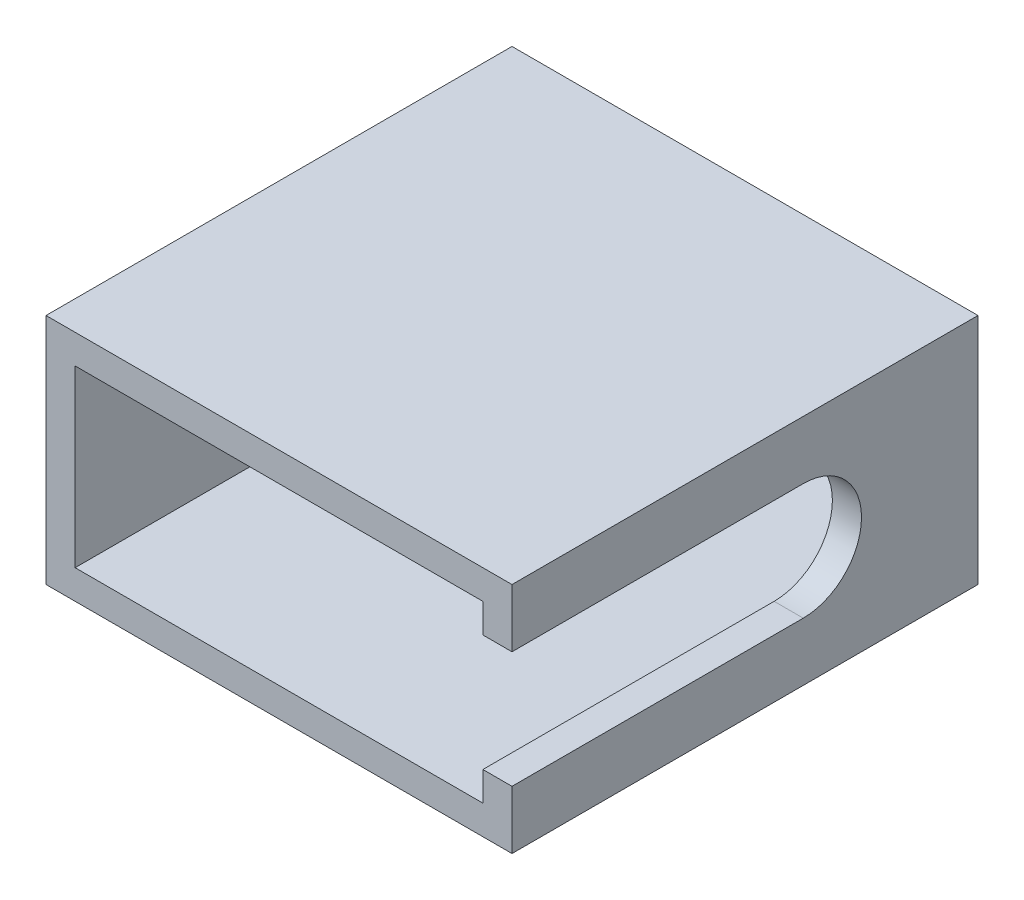
ISO-10303-21;
HEADER;
FILE_DESCRIPTION(('STEP AP214'),'2;1');
FILE_NAME('part.step','',(''),(''),'','','');
FILE_SCHEMA(('AUTOMOTIVE_DESIGN { 1 0 10303 214 1 1 1 1 }'));
ENDSEC;
DATA;
#1=APPLICATION_CONTEXT('core data for automotive mechanical design processes');
#2=APPLICATION_PROTOCOL_DEFINITION('international standard','automotive_design',2000,#1);
#3=PRODUCT_CONTEXT('',#1,'mechanical');
#4=PRODUCT('Part','Part','',(#3));
#5=PRODUCT_RELATED_PRODUCT_CATEGORY('part','',(#4));
#6=PRODUCT_DEFINITION_FORMATION('','',#4);
#7=PRODUCT_DEFINITION_CONTEXT('part definition',#1,'design');
#8=PRODUCT_DEFINITION('design','',#6,#7);
#9=PRODUCT_DEFINITION_SHAPE('','',#8);
#10=(LENGTH_UNIT() NAMED_UNIT(*) SI_UNIT(.MILLI.,.METRE.));
#11=(NAMED_UNIT(*) PLANE_ANGLE_UNIT() SI_UNIT($,.RADIAN.));
#12=(NAMED_UNIT(*) SI_UNIT($,.STERADIAN.) SOLID_ANGLE_UNIT());
#13=UNCERTAINTY_MEASURE_WITH_UNIT(LENGTH_MEASURE(1.E-05),#10,'distance_accuracy_value','');
#14=(GEOMETRIC_REPRESENTATION_CONTEXT(3) GLOBAL_UNCERTAINTY_ASSIGNED_CONTEXT((#13)) GLOBAL_UNIT_ASSIGNED_CONTEXT((#10,
#11,#12)) REPRESENTATION_CONTEXT('',''));
#15=CARTESIAN_POINT('',(0.,0.,0.));
#16=DIRECTION('',(0.,0.,1.));
#17=DIRECTION('',(1.,0.,0.));
#18=AXIS2_PLACEMENT_3D('',#15,#16,#17);
#19=CARTESIAN_POINT('',(25.4,12.7,50.8));
#20=DIRECTION('',(-1.,0.,0.));
#21=DIRECTION('',(0.,-1.,0.));
#22=AXIS2_PLACEMENT_3D('',#19,#20,#21);
#23=PLANE('',#22);
#24=DIRECTION('',(0.,1.,0.));
#25=VECTOR('',#24,1.);
#26=CARTESIAN_POINT('',(25.4,12.7,50.8));
#27=LINE('',#26,#25);
#28=CARTESIAN_POINT('',(25.4,6.35000000000001,50.8));
#29=VERTEX_POINT('',#28);
#30=CARTESIAN_POINT('',(25.4,12.7,50.8));
#31=VERTEX_POINT('',#30);
#32=EDGE_CURVE('E137',#29,#31,#27,.T.);
#33=ORIENTED_EDGE('',*,*,#32,.F.);
#34=DIRECTION('',(0.,0.,1.));
#35=VECTOR('',#34,1.);
#36=CARTESIAN_POINT('',(25.4,6.35000000000001,50.8));
#37=LINE('',#36,#35);
#38=CARTESIAN_POINT('',(25.4,6.35000000000001,19.05));
#39=VERTEX_POINT('',#38);
#40=EDGE_CURVE('E120',#39,#29,#37,.T.);
#41=ORIENTED_EDGE('',*,*,#40,.F.);
#42=CARTESIAN_POINT('',(25.4,0.,19.05));
#43=DIRECTION('',(1.,0.,0.));
#44=DIRECTION('',(0.,1.,0.));
#45=AXIS2_PLACEMENT_3D('',#42,#43,#44);
#46=CIRCLE('',#45,6.35);
#47=CARTESIAN_POINT('',(25.4,-6.34999999999999,19.05));
#48=VERTEX_POINT('',#47);
#49=EDGE_CURVE('E132',#48,#39,#46,.T.);
#50=ORIENTED_EDGE('',*,*,#49,.F.);
#51=DIRECTION('',(0.,0.,-1.));
#52=VECTOR('',#51,1.);
#53=CARTESIAN_POINT('',(25.4,-6.34999999999999,50.8));
#54=LINE('',#53,#52);
#55=CARTESIAN_POINT('',(25.4,-6.34999999999999,50.8));
#56=VERTEX_POINT('',#55);
#57=EDGE_CURVE('E191',#56,#48,#54,.T.);
#58=ORIENTED_EDGE('',*,*,#57,.F.);
#59=CARTESIAN_POINT('',(25.4,-12.7,50.8));
#60=VERTEX_POINT('',#59);
#61=EDGE_CURVE('E146',#60,#56,#27,.T.);
#62=ORIENTED_EDGE('',*,*,#61,.F.);
#63=DIRECTION('',(0.,0.,-1.));
#64=VECTOR('',#63,1.);
#65=CARTESIAN_POINT('',(25.4,-12.7,50.8));
#66=LINE('',#65,#64);
#67=CARTESIAN_POINT('',(25.4,-12.7,0.));
#68=VERTEX_POINT('',#67);
#69=EDGE_CURVE('E162',#60,#68,#66,.T.);
#70=ORIENTED_EDGE('',*,*,#69,.T.);
#71=DIRECTION('',(0.,1.,0.));
#72=VECTOR('',#71,1.);
#73=CARTESIAN_POINT('',(25.4,12.7,0.));
#74=LINE('',#73,#72);
#75=CARTESIAN_POINT('',(25.4,12.7,0.));
#76=VERTEX_POINT('',#75);
#77=EDGE_CURVE('E163',#68,#76,#74,.T.);
#78=ORIENTED_EDGE('',*,*,#77,.T.);
#79=DIRECTION('',(0.,0.,-1.));
#80=VECTOR('',#79,1.);
#81=CARTESIAN_POINT('',(25.4,12.7,50.8));
#82=LINE('',#81,#80);
#83=EDGE_CURVE('E11',#31,#76,#82,.T.);
#84=ORIENTED_EDGE('',*,*,#83,.F.);
#85=EDGE_LOOP('',(#33,#41,#50,#58,#62,#70,#78,#84));
#86=FACE_BOUND('',#85,.T.);
#87=ADVANCED_FACE('F33',(#86),#23,.F.);
#88=CARTESIAN_POINT('',(-25.4,12.7,50.8));
#89=DIRECTION('',(0.,-1.,0.));
#90=DIRECTION('',(0.,0.,-1.));
#91=AXIS2_PLACEMENT_3D('',#88,#89,#90);
#92=PLANE('',#91);
#93=DIRECTION('',(-1.,0.,0.));
#94=VECTOR('',#93,1.);
#95=CARTESIAN_POINT('',(-25.4,12.7,0.));
#96=LINE('',#95,#94);
#97=CARTESIAN_POINT('',(-25.4,12.7,0.));
#98=VERTEX_POINT('',#97);
#99=EDGE_CURVE('E165',#76,#98,#96,.T.);
#100=ORIENTED_EDGE('',*,*,#99,.T.);
#101=DIRECTION('',(0.,0.,-1.));
#102=VECTOR('',#101,1.);
#103=CARTESIAN_POINT('',(-25.4,12.7,50.8));
#104=LINE('',#103,#102);
#105=CARTESIAN_POINT('',(-25.4,12.7,50.8));
#106=VERTEX_POINT('',#105);
#107=EDGE_CURVE('E40',#106,#98,#104,.T.);
#108=ORIENTED_EDGE('',*,*,#107,.F.);
#109=DIRECTION('',(-1.,0.,0.));
#110=VECTOR('',#109,1.);
#111=CARTESIAN_POINT('',(-25.4,12.7,50.8));
#112=LINE('',#111,#110);
#113=EDGE_CURVE('E150',#31,#106,#112,.T.);
#114=ORIENTED_EDGE('',*,*,#113,.F.);
#115=ORIENTED_EDGE('',*,*,#83,.T.);
#116=EDGE_LOOP('',(#100,#108,#114,#115));
#117=FACE_BOUND('',#116,.T.);
#118=ADVANCED_FACE('F196',(#117),#92,.F.);
#119=CARTESIAN_POINT('',(-25.4,12.7,50.8));
#120=DIRECTION('',(1.,0.,0.));
#121=DIRECTION('',(0.,1.,0.));
#122=AXIS2_PLACEMENT_3D('',#119,#120,#121);
#123=PLANE('',#122);
#124=DIRECTION('',(0.,-1.,0.));
#125=VECTOR('',#124,1.);
#126=CARTESIAN_POINT('',(-25.4,12.7,0.));
#127=LINE('',#126,#125);
#128=CARTESIAN_POINT('',(-25.4,-12.7,0.));
#129=VERTEX_POINT('',#128);
#130=EDGE_CURVE('E151',#98,#129,#127,.T.);
#131=ORIENTED_EDGE('',*,*,#130,.T.);
#132=DIRECTION('',(0.,0.,-1.));
#133=VECTOR('',#132,1.);
#134=CARTESIAN_POINT('',(-25.4,-12.7,50.8));
#135=LINE('',#134,#133);
#136=CARTESIAN_POINT('',(-25.4,-12.7,50.8));
#137=VERTEX_POINT('',#136);
#138=EDGE_CURVE('E171',#137,#129,#135,.T.);
#139=ORIENTED_EDGE('',*,*,#138,.F.);
#140=DIRECTION('',(0.,-1.,0.));
#141=VECTOR('',#140,1.);
#142=CARTESIAN_POINT('',(-25.4,12.7,50.8));
#143=LINE('',#142,#141);
#144=EDGE_CURVE('E158',#106,#137,#143,.T.);
#145=ORIENTED_EDGE('',*,*,#144,.F.);
#146=ORIENTED_EDGE('',*,*,#107,.T.);
#147=EDGE_LOOP('',(#131,#139,#145,#146));
#148=FACE_BOUND('',#147,.T.);
#149=ADVANCED_FACE('F178',(#148),#123,.F.);
#150=CARTESIAN_POINT('',(-25.4,-12.7,50.8));
#151=DIRECTION('',(0.,1.,0.));
#152=DIRECTION('',(0.,0.,1.));
#153=AXIS2_PLACEMENT_3D('',#150,#151,#152);
#154=PLANE('',#153);
#155=DIRECTION('',(1.,0.,0.));
#156=VECTOR('',#155,1.);
#157=CARTESIAN_POINT('',(-25.4,-12.7,0.));
#158=LINE('',#157,#156);
#159=EDGE_CURVE('E147',#129,#68,#158,.T.);
#160=ORIENTED_EDGE('',*,*,#159,.T.);
#161=ORIENTED_EDGE('',*,*,#69,.F.);
#162=DIRECTION('',(1.,0.,0.));
#163=VECTOR('',#162,1.);
#164=CARTESIAN_POINT('',(-25.4,-12.7,50.8));
#165=LINE('',#164,#163);
#166=EDGE_CURVE('E160',#137,#60,#165,.T.);
#167=ORIENTED_EDGE('',*,*,#166,.F.);
#168=ORIENTED_EDGE('',*,*,#138,.T.);
#169=EDGE_LOOP('',(#160,#161,#167,#168));
#170=FACE_BOUND('',#169,.T.);
#171=ADVANCED_FACE('F187',(#170),#154,.F.);
#172=CARTESIAN_POINT('',(25.4,-12.7,50.8));
#173=DIRECTION('',(0.,0.,1.));
#174=DIRECTION('',(1.,0.,0.));
#175=AXIS2_PLACEMENT_3D('',#172,#173,#174);
#176=PLANE('',#175);
#177=DIRECTION('',(1.,0.,0.));
#178=VECTOR('',#177,1.);
#179=CARTESIAN_POINT('',(-25.401,6.35,50.8));
#180=LINE('',#179,#178);
#181=CARTESIAN_POINT('',(22.225,6.35000000000001,50.8));
#182=VERTEX_POINT('',#181);
#183=EDGE_CURVE('E123',#182,#29,#180,.T.);
#184=ORIENTED_EDGE('',*,*,#183,.T.);
#185=ORIENTED_EDGE('',*,*,#32,.T.);
#186=ORIENTED_EDGE('',*,*,#113,.T.);
#187=ORIENTED_EDGE('',*,*,#144,.T.);
#188=ORIENTED_EDGE('',*,*,#166,.T.);
#189=ORIENTED_EDGE('',*,*,#61,.T.);
#190=DIRECTION('',(1.,0.,0.));
#191=VECTOR('',#190,1.);
#192=CARTESIAN_POINT('',(-25.401,-6.35,50.8));
#193=LINE('',#192,#191);
#194=CARTESIAN_POINT('',(22.225,-6.34999999999999,50.8));
#195=VERTEX_POINT('',#194);
#196=EDGE_CURVE('E194',#195,#56,#193,.T.);
#197=ORIENTED_EDGE('',*,*,#196,.F.);
#198=DIRECTION('',(0.,1.,0.));
#199=VECTOR('',#198,1.);
#200=CARTESIAN_POINT('',(22.225,12.7,50.8));
#201=LINE('',#200,#199);
#202=CARTESIAN_POINT('',(22.225,-9.52499999999999,50.8));
#203=VERTEX_POINT('',#202);
#204=EDGE_CURVE('E263',#203,#195,#201,.T.);
#205=ORIENTED_EDGE('',*,*,#204,.F.);
#206=DIRECTION('',(1.,0.,0.));
#207=VECTOR('',#206,1.);
#208=CARTESIAN_POINT('',(-25.4,-9.52499999999999,50.8));
#209=LINE('',#208,#207);
#210=CARTESIAN_POINT('',(-22.225,-9.52499999999999,50.8));
#211=VERTEX_POINT('',#210);
#212=EDGE_CURVE('E155',#211,#203,#209,.T.);
#213=ORIENTED_EDGE('',*,*,#212,.F.);
#214=DIRECTION('',(0.,-1.,0.));
#215=VECTOR('',#214,1.);
#216=CARTESIAN_POINT('',(-22.225,12.7,50.8));
#217=LINE('',#216,#215);
#218=CARTESIAN_POINT('',(-22.225,9.52500000000001,50.8));
#219=VERTEX_POINT('',#218);
#220=EDGE_CURVE('E266',#219,#211,#217,.T.);
#221=ORIENTED_EDGE('',*,*,#220,.F.);
#222=DIRECTION('',(-1.,0.,0.));
#223=VECTOR('',#222,1.);
#224=CARTESIAN_POINT('',(-25.4,9.52500000000001,50.8));
#225=LINE('',#224,#223);
#226=CARTESIAN_POINT('',(22.225,9.52500000000001,50.8));
#227=VERTEX_POINT('',#226);
#228=EDGE_CURVE('E265',#227,#219,#225,.T.);
#229=ORIENTED_EDGE('',*,*,#228,.F.);
#230=EDGE_CURVE('E140',#182,#227,#201,.T.);
#231=ORIENTED_EDGE('',*,*,#230,.F.);
#232=EDGE_LOOP('',(#184,#185,#186,#187,#188,#189,#197,#205,#213,#221,#229,#231));
#233=FACE_BOUND('',#232,.T.);
#234=ADVANCED_FACE('F136',(#233),#176,.T.);
#235=CARTESIAN_POINT('',(25.4,-12.7,0.));
#236=DIRECTION('',(0.,0.,1.));
#237=DIRECTION('',(1.,0.,0.));
#238=AXIS2_PLACEMENT_3D('',#235,#236,#237);
#239=PLANE('',#238);
#240=DIRECTION('',(1.,0.,0.));
#241=VECTOR('',#240,1.);
#242=CARTESIAN_POINT('',(-25.4,-9.52499999999999,0.));
#243=LINE('',#242,#241);
#244=CARTESIAN_POINT('',(-22.225,-9.52499999999999,0.));
#245=VERTEX_POINT('',#244);
#246=CARTESIAN_POINT('',(22.225,-9.52499999999999,0.));
#247=VERTEX_POINT('',#246);
#248=EDGE_CURVE('E255',#245,#247,#243,.T.);
#249=ORIENTED_EDGE('',*,*,#248,.T.);
#250=DIRECTION('',(0.,1.,0.));
#251=VECTOR('',#250,1.);
#252=CARTESIAN_POINT('',(22.225,12.7,0.));
#253=LINE('',#252,#251);
#254=CARTESIAN_POINT('',(22.225,9.52500000000001,0.));
#255=VERTEX_POINT('',#254);
#256=EDGE_CURVE('E131',#247,#255,#253,.T.);
#257=ORIENTED_EDGE('',*,*,#256,.T.);
#258=DIRECTION('',(-1.,0.,0.));
#259=VECTOR('',#258,1.);
#260=CARTESIAN_POINT('',(-25.4,9.52500000000001,0.));
#261=LINE('',#260,#259);
#262=CARTESIAN_POINT('',(-22.225,9.52500000000001,0.));
#263=VERTEX_POINT('',#262);
#264=EDGE_CURVE('E254',#255,#263,#261,.T.);
#265=ORIENTED_EDGE('',*,*,#264,.T.);
#266=DIRECTION('',(0.,-1.,0.));
#267=VECTOR('',#266,1.);
#268=CARTESIAN_POINT('',(-22.225,12.7,0.));
#269=LINE('',#268,#267);
#270=EDGE_CURVE('E258',#263,#245,#269,.T.);
#271=ORIENTED_EDGE('',*,*,#270,.T.);
#272=EDGE_LOOP('',(#249,#257,#265,#271));
#273=FACE_BOUND('',#272,.T.);
#274=ORIENTED_EDGE('',*,*,#77,.F.);
#275=ORIENTED_EDGE('',*,*,#159,.F.);
#276=ORIENTED_EDGE('',*,*,#130,.F.);
#277=ORIENTED_EDGE('',*,*,#99,.F.);
#278=EDGE_LOOP('',(#274,#275,#276,#277));
#279=FACE_BOUND('',#278,.T.);
#280=ADVANCED_FACE('F184',(#273,#279),#239,.F.);
#281=CARTESIAN_POINT('',(22.225,12.7,50.8));
#282=DIRECTION('',(-1.,0.,0.));
#283=DIRECTION('',(0.,-1.,0.));
#284=AXIS2_PLACEMENT_3D('',#281,#282,#283);
#285=PLANE('',#284);
#286=DIRECTION('',(0.,0.,1.));
#287=VECTOR('',#286,1.);
#288=CARTESIAN_POINT('',(22.225,6.35000000000001,50.8));
#289=LINE('',#288,#287);
#290=CARTESIAN_POINT('',(22.225,6.35000000000001,19.05));
#291=VERTEX_POINT('',#290);
#292=EDGE_CURVE('E142',#291,#182,#289,.T.);
#293=ORIENTED_EDGE('',*,*,#292,.T.);
#294=ORIENTED_EDGE('',*,*,#230,.T.);
#295=DIRECTION('',(0.,0.,-1.));
#296=VECTOR('',#295,1.);
#297=CARTESIAN_POINT('',(22.225,9.52500000000001,50.8));
#298=LINE('',#297,#296);
#299=EDGE_CURVE('E166',#227,#255,#298,.T.);
#300=ORIENTED_EDGE('',*,*,#299,.T.);
#301=ORIENTED_EDGE('',*,*,#256,.F.);
#302=DIRECTION('',(0.,0.,-1.));
#303=VECTOR('',#302,1.);
#304=CARTESIAN_POINT('',(22.225,-9.52499999999999,50.8));
#305=LINE('',#304,#303);
#306=EDGE_CURVE('E247',#203,#247,#305,.T.);
#307=ORIENTED_EDGE('',*,*,#306,.F.);
#308=ORIENTED_EDGE('',*,*,#204,.T.);
#309=DIRECTION('',(0.,0.,-1.));
#310=VECTOR('',#309,1.);
#311=CARTESIAN_POINT('',(22.225,-6.34999999999999,50.8));
#312=LINE('',#311,#310);
#313=CARTESIAN_POINT('',(22.225,-6.34999999999999,19.05));
#314=VERTEX_POINT('',#313);
#315=EDGE_CURVE('E238',#195,#314,#312,.T.);
#316=ORIENTED_EDGE('',*,*,#315,.T.);
#317=CARTESIAN_POINT('',(22.225,0.,19.05));
#318=DIRECTION('',(-1.,0.,0.));
#319=DIRECTION('',(0.,-1.,0.));
#320=AXIS2_PLACEMENT_3D('',#317,#318,#319);
#321=CIRCLE('',#320,6.35);
#322=EDGE_CURVE('E141',#314,#291,#321,.F.);
#323=ORIENTED_EDGE('',*,*,#322,.T.);
#324=EDGE_LOOP('',(#293,#294,#300,#301,#307,#308,#316,#323));
#325=FACE_BOUND('',#324,.T.);
#326=ADVANCED_FACE('F209',(#325),#285,.T.);
#327=CARTESIAN_POINT('',(-25.4,9.52500000000001,50.8));
#328=DIRECTION('',(0.,-1.,0.));
#329=DIRECTION('',(0.,0.,-1.));
#330=AXIS2_PLACEMENT_3D('',#327,#328,#329);
#331=PLANE('',#330);
#332=ORIENTED_EDGE('',*,*,#264,.F.);
#333=ORIENTED_EDGE('',*,*,#299,.F.);
#334=ORIENTED_EDGE('',*,*,#228,.T.);
#335=DIRECTION('',(0.,0.,-1.));
#336=VECTOR('',#335,1.);
#337=CARTESIAN_POINT('',(-22.225,9.52500000000001,50.8));
#338=LINE('',#337,#336);
#339=EDGE_CURVE('E246',#219,#263,#338,.T.);
#340=ORIENTED_EDGE('',*,*,#339,.T.);
#341=EDGE_LOOP('',(#332,#333,#334,#340));
#342=FACE_BOUND('',#341,.T.);
#343=ADVANCED_FACE('F219',(#342),#331,.T.);
#344=CARTESIAN_POINT('',(-22.225,12.7,50.8));
#345=DIRECTION('',(1.,0.,0.));
#346=DIRECTION('',(0.,1.,0.));
#347=AXIS2_PLACEMENT_3D('',#344,#345,#346);
#348=PLANE('',#347);
#349=ORIENTED_EDGE('',*,*,#270,.F.);
#350=ORIENTED_EDGE('',*,*,#339,.F.);
#351=ORIENTED_EDGE('',*,*,#220,.T.);
#352=DIRECTION('',(0.,0.,-1.));
#353=VECTOR('',#352,1.);
#354=CARTESIAN_POINT('',(-22.225,-9.52499999999999,50.8));
#355=LINE('',#354,#353);
#356=EDGE_CURVE('E55',#211,#245,#355,.T.);
#357=ORIENTED_EDGE('',*,*,#356,.T.);
#358=EDGE_LOOP('',(#349,#350,#351,#357));
#359=FACE_BOUND('',#358,.T.);
#360=ADVANCED_FACE('F216',(#359),#348,.T.);
#361=CARTESIAN_POINT('',(-25.4,-9.52499999999999,50.8));
#362=DIRECTION('',(0.,1.,0.));
#363=DIRECTION('',(0.,0.,1.));
#364=AXIS2_PLACEMENT_3D('',#361,#362,#363);
#365=PLANE('',#364);
#366=ORIENTED_EDGE('',*,*,#248,.F.);
#367=ORIENTED_EDGE('',*,*,#356,.F.);
#368=ORIENTED_EDGE('',*,*,#212,.T.);
#369=ORIENTED_EDGE('',*,*,#306,.T.);
#370=EDGE_LOOP('',(#366,#367,#368,#369));
#371=FACE_BOUND('',#370,.T.);
#372=ADVANCED_FACE('F213',(#371),#365,.T.);
#373=CARTESIAN_POINT('',(-25.401,6.35,50.8));
#374=DIRECTION('',(0.,1.,0.));
#375=DIRECTION('',(-1.,0.,0.));
#376=AXIS2_PLACEMENT_3D('',#373,#374,#375);
#377=PLANE('',#376);
#378=DIRECTION('',(1.,0.,0.));
#379=VECTOR('',#378,1.);
#380=CARTESIAN_POINT('',(-25.401,6.35,19.05));
#381=LINE('',#380,#379);
#382=EDGE_CURVE('E126',#291,#39,#381,.T.);
#383=ORIENTED_EDGE('',*,*,#382,.T.);
#384=ORIENTED_EDGE('',*,*,#40,.T.);
#385=ORIENTED_EDGE('',*,*,#183,.F.);
#386=ORIENTED_EDGE('',*,*,#292,.F.);
#387=EDGE_LOOP('',(#383,#384,#385,#386));
#388=FACE_BOUND('',#387,.T.);
#389=ADVANCED_FACE('F122',(#388),#377,.F.);
#390=CARTESIAN_POINT('',(-25.401,0.,19.05));
#391=DIRECTION('',(1.,0.,0.));
#392=DIRECTION('',(0.,1.,0.));
#393=AXIS2_PLACEMENT_3D('',#390,#391,#392);
#394=CYLINDRICAL_SURFACE('',#393,6.35);
#395=DIRECTION('',(1.,0.,0.));
#396=VECTOR('',#395,1.);
#397=CARTESIAN_POINT('',(-25.401,-6.35,19.05));
#398=LINE('',#397,#396);
#399=EDGE_CURVE('E47',#314,#48,#398,.T.);
#400=ORIENTED_EDGE('',*,*,#399,.T.);
#401=ORIENTED_EDGE('',*,*,#49,.T.);
#402=ORIENTED_EDGE('',*,*,#382,.F.);
#403=ORIENTED_EDGE('',*,*,#322,.F.);
#404=EDGE_LOOP('',(#400,#401,#402,#403));
#405=FACE_BOUND('',#404,.T.);
#406=ADVANCED_FACE('F229',(#405),#394,.F.);
#407=CARTESIAN_POINT('',(-25.401,-6.35,50.8));
#408=DIRECTION('',(0.,-1.,0.));
#409=DIRECTION('',(1.,0.,0.));
#410=AXIS2_PLACEMENT_3D('',#407,#408,#409);
#411=PLANE('',#410);
#412=ORIENTED_EDGE('',*,*,#196,.T.);
#413=ORIENTED_EDGE('',*,*,#57,.T.);
#414=ORIENTED_EDGE('',*,*,#399,.F.);
#415=ORIENTED_EDGE('',*,*,#315,.F.);
#416=EDGE_LOOP('',(#412,#413,#414,#415));
#417=FACE_BOUND('',#416,.T.);
#418=ADVANCED_FACE('F232',(#417),#411,.F.);
#419=CLOSED_SHELL('',(#87,#118,#149,#171,#234,#280,#326,#343,#360,#372,#389,#406,#418));
#420=MANIFOLD_SOLID_BREP('B2',#419);
#421=ADVANCED_BREP_SHAPE_REPRESENTATION('',(#18,#420),#14);
#422=SHAPE_DEFINITION_REPRESENTATION(#9,#421);
ENDSEC;
END-ISO-10303-21;
